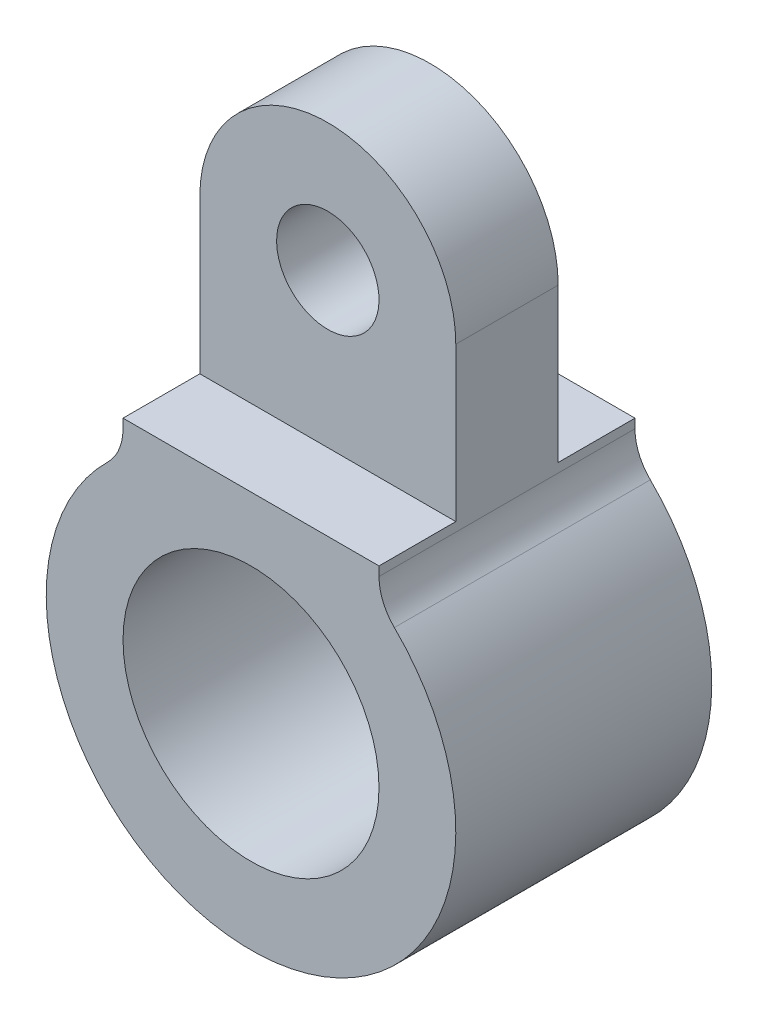
ISO-10303-21;
HEADER;
FILE_DESCRIPTION(('STEP AP214'),'2;1');
FILE_NAME('part.step','',(''),(''),'','','');
FILE_SCHEMA(('AUTOMOTIVE_DESIGN { 1 0 10303 214 1 1 1 1 }'));
ENDSEC;
DATA;
#1=APPLICATION_CONTEXT('core data for automotive mechanical design processes');
#2=APPLICATION_PROTOCOL_DEFINITION('international standard','automotive_design',2000,#1);
#3=PRODUCT_CONTEXT('',#1,'mechanical');
#4=PRODUCT('Part','Part','',(#3));
#5=PRODUCT_RELATED_PRODUCT_CATEGORY('part','',(#4));
#6=PRODUCT_DEFINITION_FORMATION('','',#4);
#7=PRODUCT_DEFINITION_CONTEXT('part definition',#1,'design');
#8=PRODUCT_DEFINITION('design','',#6,#7);
#9=PRODUCT_DEFINITION_SHAPE('','',#8);
#10=(LENGTH_UNIT() NAMED_UNIT(*) SI_UNIT(.MILLI.,.METRE.));
#11=(NAMED_UNIT(*) PLANE_ANGLE_UNIT() SI_UNIT($,.RADIAN.));
#12=(NAMED_UNIT(*) SI_UNIT($,.STERADIAN.) SOLID_ANGLE_UNIT());
#13=UNCERTAINTY_MEASURE_WITH_UNIT(LENGTH_MEASURE(1.E-05),#10,'distance_accuracy_value','');
#14=(GEOMETRIC_REPRESENTATION_CONTEXT(3) GLOBAL_UNCERTAINTY_ASSIGNED_CONTEXT((#13)) GLOBAL_UNIT_ASSIGNED_CONTEXT((#10,
#11,#12)) REPRESENTATION_CONTEXT('',''));
#15=CARTESIAN_POINT('',(0.,0.,0.));
#16=DIRECTION('',(0.,0.,1.));
#17=DIRECTION('',(1.,0.,0.));
#18=AXIS2_PLACEMENT_3D('',#15,#16,#17);
#19=CARTESIAN_POINT('',(0.,27.,20.));
#20=DIRECTION('',(0.,0.,1.));
#21=DIRECTION('',(1.,0.,0.));
#22=AXIS2_PLACEMENT_3D('',#19,#20,#21);
#23=PLANE('',#22);
#24=DIRECTION('',(1.,0.,0.));
#25=VECTOR('',#24,1.);
#26=CARTESIAN_POINT('',(0.,15.,20.));
#27=LINE('',#26,#25);
#28=CARTESIAN_POINT('',(-10.,15.,20.));
#29=VERTEX_POINT('',#28);
#30=CARTESIAN_POINT('',(10.,15.,20.));
#31=VERTEX_POINT('',#30);
#32=EDGE_CURVE('E55',#29,#31,#27,.T.);
#33=ORIENTED_EDGE('',*,*,#32,.F.);
#34=DIRECTION('',(0.,-1.,0.));
#35=VECTOR('',#34,1.);
#36=CARTESIAN_POINT('',(-10.,27.,20.));
#37=LINE('',#36,#35);
#38=CARTESIAN_POINT('',(-10.,14.2828568570857,20.));
#39=VERTEX_POINT('',#38);
#40=EDGE_CURVE('E135',#29,#39,#37,.T.);
#41=ORIENTED_EDGE('',*,*,#40,.T.);
#42=CARTESIAN_POINT('',(-14.,14.2828568570857,20.));
#43=DIRECTION('',(0.,0.,1.));
#44=DIRECTION('',(1.,0.,0.));
#45=AXIS2_PLACEMENT_3D('',#42,#43,#44);
#46=CIRCLE('',#45,4.);
#47=CARTESIAN_POINT('',(-11.2,11.4262854856686,20.));
#48=VERTEX_POINT('',#47);
#49=EDGE_CURVE('E196',#39,#48,#46,.F.);
#50=ORIENTED_EDGE('',*,*,#49,.T.);
#51=CARTESIAN_POINT('',(0.,0.,20.));
#52=DIRECTION('',(0.,0.,1.));
#53=DIRECTION('',(1.,0.,0.));
#54=AXIS2_PLACEMENT_3D('',#51,#52,#53);
#55=CIRCLE('',#54,16.);
#56=CARTESIAN_POINT('',(11.2,11.4262854856686,20.));
#57=VERTEX_POINT('',#56);
#58=EDGE_CURVE('E168',#48,#57,#55,.T.);
#59=ORIENTED_EDGE('',*,*,#58,.T.);
#60=CARTESIAN_POINT('',(14.,14.2828568570857,20.));
#61=DIRECTION('',(0.,0.,1.));
#62=DIRECTION('',(1.,0.,0.));
#63=AXIS2_PLACEMENT_3D('',#60,#61,#62);
#64=CIRCLE('',#63,4.);
#65=CARTESIAN_POINT('',(10.,14.2828568570857,20.));
#66=VERTEX_POINT('',#65);
#67=EDGE_CURVE('E49',#57,#66,#64,.F.);
#68=ORIENTED_EDGE('',*,*,#67,.T.);
#69=DIRECTION('',(0.,-1.,0.));
#70=VECTOR('',#69,1.);
#71=CARTESIAN_POINT('',(10.,27.,20.));
#72=LINE('',#71,#70);
#73=EDGE_CURVE('E172',#31,#66,#72,.T.);
#74=ORIENTED_EDGE('',*,*,#73,.F.);
#75=EDGE_LOOP('',(#33,#41,#50,#59,#68,#74));
#76=FACE_BOUND('',#75,.T.);
#77=CARTESIAN_POINT('',(0.,0.,20.));
#78=DIRECTION('',(0.,0.,1.));
#79=DIRECTION('',(1.,0.,0.));
#80=AXIS2_PLACEMENT_3D('',#77,#78,#79);
#81=CIRCLE('',#80,10.);
#82=CARTESIAN_POINT('',(10.,0.,20.));
#83=VERTEX_POINT('',#82);
#84=EDGE_CURVE('E161',#83,#83,#81,.T.);
#85=ORIENTED_EDGE('',*,*,#84,.F.);
#86=EDGE_LOOP('',(#85));
#87=FACE_BOUND('',#86,.T.);
#88=ADVANCED_FACE('F41',(#76,#87),#23,.T.);
#89=CARTESIAN_POINT('',(0.,27.,0.));
#90=DIRECTION('',(0.,0.,1.));
#91=DIRECTION('',(1.,0.,0.));
#92=AXIS2_PLACEMENT_3D('',#89,#90,#91);
#93=PLANE('',#92);
#94=CARTESIAN_POINT('',(0.,0.,0.));
#95=DIRECTION('',(0.,0.,1.));
#96=DIRECTION('',(1.,0.,0.));
#97=AXIS2_PLACEMENT_3D('',#94,#95,#96);
#98=CIRCLE('',#97,10.);
#99=CARTESIAN_POINT('',(10.,0.,0.));
#100=VERTEX_POINT('',#99);
#101=EDGE_CURVE('E160',#100,#100,#98,.T.);
#102=ORIENTED_EDGE('',*,*,#101,.T.);
#103=EDGE_LOOP('',(#102));
#104=FACE_BOUND('',#103,.T.);
#105=DIRECTION('',(0.,-1.,0.));
#106=VECTOR('',#105,1.);
#107=CARTESIAN_POINT('',(-10.,27.,0.));
#108=LINE('',#107,#106);
#109=CARTESIAN_POINT('',(-10.,15.,0.));
#110=VERTEX_POINT('',#109);
#111=CARTESIAN_POINT('',(-10.,14.2828568570857,0.));
#112=VERTEX_POINT('',#111);
#113=EDGE_CURVE('E164',#110,#112,#108,.T.);
#114=ORIENTED_EDGE('',*,*,#113,.F.);
#115=DIRECTION('',(1.,0.,0.));
#116=VECTOR('',#115,1.);
#117=CARTESIAN_POINT('',(0.,15.,0.));
#118=LINE('',#117,#116);
#119=CARTESIAN_POINT('',(10.,15.,0.));
#120=VERTEX_POINT('',#119);
#121=EDGE_CURVE('E157',#110,#120,#118,.T.);
#122=ORIENTED_EDGE('',*,*,#121,.T.);
#123=DIRECTION('',(0.,-1.,0.));
#124=VECTOR('',#123,1.);
#125=CARTESIAN_POINT('',(10.,27.,0.));
#126=LINE('',#125,#124);
#127=CARTESIAN_POINT('',(10.,14.2828568570857,0.));
#128=VERTEX_POINT('',#127);
#129=EDGE_CURVE('E169',#120,#128,#126,.T.);
#130=ORIENTED_EDGE('',*,*,#129,.T.);
#131=CARTESIAN_POINT('',(14.,14.2828568570857,0.));
#132=DIRECTION('',(0.,0.,1.));
#133=DIRECTION('',(1.,0.,0.));
#134=AXIS2_PLACEMENT_3D('',#131,#132,#133);
#135=CIRCLE('',#134,4.);
#136=CARTESIAN_POINT('',(11.2,11.4262854856686,0.));
#137=VERTEX_POINT('',#136);
#138=EDGE_CURVE('E198',#128,#137,#135,.T.);
#139=ORIENTED_EDGE('',*,*,#138,.T.);
#140=CARTESIAN_POINT('',(0.,0.,0.));
#141=DIRECTION('',(0.,0.,1.));
#142=DIRECTION('',(1.,0.,0.));
#143=AXIS2_PLACEMENT_3D('',#140,#141,#142);
#144=CIRCLE('',#143,16.);
#145=CARTESIAN_POINT('',(-11.2,11.4262854856686,0.));
#146=VERTEX_POINT('',#145);
#147=EDGE_CURVE('E176',#146,#137,#144,.T.);
#148=ORIENTED_EDGE('',*,*,#147,.F.);
#149=CARTESIAN_POINT('',(-14.,14.2828568570857,0.));
#150=DIRECTION('',(0.,0.,1.));
#151=DIRECTION('',(1.,0.,0.));
#152=AXIS2_PLACEMENT_3D('',#149,#150,#151);
#153=CIRCLE('',#152,4.);
#154=EDGE_CURVE('E193',#146,#112,#153,.T.);
#155=ORIENTED_EDGE('',*,*,#154,.T.);
#156=EDGE_LOOP('',(#114,#122,#130,#139,#148,#155));
#157=FACE_BOUND('',#156,.T.);
#158=ADVANCED_FACE('F230',(#104,#157),#93,.F.);
#159=CARTESIAN_POINT('',(0.,27.,20.));
#160=DIRECTION('',(0.,0.,-1.));
#161=DIRECTION('',(-1.,0.,0.));
#162=AXIS2_PLACEMENT_3D('',#159,#160,#161);
#163=CYLINDRICAL_SURFACE('',#162,10.);
#164=DIRECTION('',(0.,0.,-1.));
#165=VECTOR('',#164,1.);
#166=CARTESIAN_POINT('',(-10.,27.,20.));
#167=LINE('',#166,#165);
#168=CARTESIAN_POINT('',(-10.,27.,14.));
#169=VERTEX_POINT('',#168);
#170=CARTESIAN_POINT('',(-10.,27.,6.));
#171=VERTEX_POINT('',#170);
#172=EDGE_CURVE('E181',#169,#171,#167,.T.);
#173=ORIENTED_EDGE('',*,*,#172,.F.);
#174=CARTESIAN_POINT('',(0.,27.,14.));
#175=DIRECTION('',(0.,0.,-1.));
#176=DIRECTION('',(0.,1.,0.));
#177=AXIS2_PLACEMENT_3D('',#174,#175,#176);
#178=CIRCLE('',#177,10.);
#179=CARTESIAN_POINT('',(10.,27.,14.));
#180=VERTEX_POINT('',#179);
#181=EDGE_CURVE('E128',#169,#180,#178,.T.);
#182=ORIENTED_EDGE('',*,*,#181,.T.);
#183=DIRECTION('',(0.,0.,-1.));
#184=VECTOR('',#183,1.);
#185=CARTESIAN_POINT('',(10.,27.,20.));
#186=LINE('',#185,#184);
#187=CARTESIAN_POINT('',(10.,27.,6.));
#188=VERTEX_POINT('',#187);
#189=EDGE_CURVE('E174',#180,#188,#186,.T.);
#190=ORIENTED_EDGE('',*,*,#189,.T.);
#191=CARTESIAN_POINT('',(0.,27.,6.));
#192=DIRECTION('',(0.,0.,1.));
#193=DIRECTION('',(0.,-1.,0.));
#194=AXIS2_PLACEMENT_3D('',#191,#192,#193);
#195=CIRCLE('',#194,10.);
#196=EDGE_CURVE('E154',#188,#171,#195,.T.);
#197=ORIENTED_EDGE('',*,*,#196,.T.);
#198=EDGE_LOOP('',(#173,#182,#190,#197));
#199=FACE_BOUND('',#198,.T.);
#200=ADVANCED_FACE('F236',(#199),#163,.T.);
#201=CARTESIAN_POINT('',(-10.,27.,20.));
#202=DIRECTION('',(1.,0.,0.));
#203=DIRECTION('',(0.,0.,-1.));
#204=AXIS2_PLACEMENT_3D('',#201,#202,#203);
#205=PLANE('',#204);
#206=DIRECTION('',(0.,0.,-1.));
#207=VECTOR('',#206,1.);
#208=CARTESIAN_POINT('',(-10.,15.,14.));
#209=LINE('',#208,#207);
#210=CARTESIAN_POINT('',(-10.,15.,14.));
#211=VERTEX_POINT('',#210);
#212=EDGE_CURVE('E119',#29,#211,#209,.T.);
#213=ORIENTED_EDGE('',*,*,#212,.T.);
#214=DIRECTION('',(0.,1.,0.));
#215=VECTOR('',#214,1.);
#216=CARTESIAN_POINT('',(-10.,37.9999999999998,14.));
#217=LINE('',#216,#215);
#218=EDGE_CURVE('E123',#211,#169,#217,.T.);
#219=ORIENTED_EDGE('',*,*,#218,.T.);
#220=ORIENTED_EDGE('',*,*,#172,.T.);
#221=DIRECTION('',(0.,-1.,0.));
#222=VECTOR('',#221,1.);
#223=CARTESIAN_POINT('',(-10.,37.9999999999998,6.));
#224=LINE('',#223,#222);
#225=CARTESIAN_POINT('',(-10.,15.,6.));
#226=VERTEX_POINT('',#225);
#227=EDGE_CURVE('E143',#171,#226,#224,.T.);
#228=ORIENTED_EDGE('',*,*,#227,.T.);
#229=DIRECTION('',(0.,0.,-1.));
#230=VECTOR('',#229,1.);
#231=CARTESIAN_POINT('',(-10.,15.,6.));
#232=LINE('',#231,#230);
#233=EDGE_CURVE('E146',#226,#110,#232,.T.);
#234=ORIENTED_EDGE('',*,*,#233,.T.);
#235=ORIENTED_EDGE('',*,*,#113,.T.);
#236=DIRECTION('',(0.,0.,1.));
#237=VECTOR('',#236,1.);
#238=CARTESIAN_POINT('',(-10.,14.2828568570857,20.));
#239=LINE('',#238,#237);
#240=EDGE_CURVE('E188',#112,#39,#239,.T.);
#241=ORIENTED_EDGE('',*,*,#240,.T.);
#242=ORIENTED_EDGE('',*,*,#40,.F.);
#243=EDGE_LOOP('',(#213,#219,#220,#228,#234,#235,#241,#242));
#244=FACE_BOUND('',#243,.T.);
#245=ADVANCED_FACE('F133',(#244),#205,.F.);
#246=CARTESIAN_POINT('',(0.,0.,20.));
#247=DIRECTION('',(0.,0.,-1.));
#248=DIRECTION('',(-1.,0.,0.));
#249=AXIS2_PLACEMENT_3D('',#246,#247,#248);
#250=CYLINDRICAL_SURFACE('',#249,16.);
#251=ORIENTED_EDGE('',*,*,#58,.F.);
#252=DIRECTION('',(0.,0.,-1.));
#253=VECTOR('',#252,1.);
#254=CARTESIAN_POINT('',(-11.2,11.4262854856686,20.));
#255=LINE('',#254,#253);
#256=EDGE_CURVE('E185',#48,#146,#255,.T.);
#257=ORIENTED_EDGE('',*,*,#256,.T.);
#258=ORIENTED_EDGE('',*,*,#147,.T.);
#259=DIRECTION('',(0.,0.,-1.));
#260=VECTOR('',#259,1.);
#261=CARTESIAN_POINT('',(11.2,11.4262854856686,20.));
#262=LINE('',#261,#260);
#263=EDGE_CURVE('E183',#137,#57,#262,.F.);
#264=ORIENTED_EDGE('',*,*,#263,.T.);
#265=EDGE_LOOP('',(#251,#257,#258,#264));
#266=FACE_BOUND('',#265,.T.);
#267=ADVANCED_FACE('F246',(#266),#250,.T.);
#268=CARTESIAN_POINT('',(10.,27.,20.));
#269=DIRECTION('',(1.,0.,0.));
#270=DIRECTION('',(0.,0.,-1.));
#271=AXIS2_PLACEMENT_3D('',#268,#269,#270);
#272=PLANE('',#271);
#273=DIRECTION('',(0.,1.,0.));
#274=VECTOR('',#273,1.);
#275=CARTESIAN_POINT('',(10.,37.9999999999998,14.));
#276=LINE('',#275,#274);
#277=CARTESIAN_POINT('',(10.,15.,14.));
#278=VERTEX_POINT('',#277);
#279=EDGE_CURVE('E136',#278,#180,#276,.T.);
#280=ORIENTED_EDGE('',*,*,#279,.F.);
#281=DIRECTION('',(0.,0.,-1.));
#282=VECTOR('',#281,1.);
#283=CARTESIAN_POINT('',(10.,15.,20.));
#284=LINE('',#283,#282);
#285=EDGE_CURVE('E11',#31,#278,#284,.T.);
#286=ORIENTED_EDGE('',*,*,#285,.F.);
#287=ORIENTED_EDGE('',*,*,#73,.T.);
#288=DIRECTION('',(0.,0.,-1.));
#289=VECTOR('',#288,1.);
#290=CARTESIAN_POINT('',(10.,14.2828568570857,20.));
#291=LINE('',#290,#289);
#292=EDGE_CURVE('E190',#66,#128,#291,.T.);
#293=ORIENTED_EDGE('',*,*,#292,.T.);
#294=ORIENTED_EDGE('',*,*,#129,.F.);
#295=DIRECTION('',(0.,0.,-1.));
#296=VECTOR('',#295,1.);
#297=CARTESIAN_POINT('',(10.,15.,6.));
#298=LINE('',#297,#296);
#299=CARTESIAN_POINT('',(10.,15.,6.));
#300=VERTEX_POINT('',#299);
#301=EDGE_CURVE('E147',#300,#120,#298,.T.);
#302=ORIENTED_EDGE('',*,*,#301,.F.);
#303=DIRECTION('',(0.,-1.,0.));
#304=VECTOR('',#303,1.);
#305=CARTESIAN_POINT('',(10.,37.9999999999998,6.));
#306=LINE('',#305,#304);
#307=EDGE_CURVE('E142',#188,#300,#306,.T.);
#308=ORIENTED_EDGE('',*,*,#307,.F.);
#309=ORIENTED_EDGE('',*,*,#189,.F.);
#310=EDGE_LOOP('',(#280,#286,#287,#293,#294,#302,#308,#309));
#311=FACE_BOUND('',#310,.T.);
#312=ADVANCED_FACE('F227',(#311),#272,.T.);
#313=CARTESIAN_POINT('',(0.,0.,20.));
#314=DIRECTION('',(0.,0.,-1.));
#315=DIRECTION('',(-1.,0.,0.));
#316=AXIS2_PLACEMENT_3D('',#313,#314,#315);
#317=CYLINDRICAL_SURFACE('',#316,10.);
#318=ORIENTED_EDGE('',*,*,#84,.T.);
#319=EDGE_LOOP('',(#318));
#320=FACE_BOUND('',#319,.T.);
#321=ORIENTED_EDGE('',*,*,#101,.F.);
#322=EDGE_LOOP('',(#321));
#323=FACE_BOUND('',#322,.T.);
#324=ADVANCED_FACE('F211',(#320,#323),#317,.F.);
#325=CARTESIAN_POINT('',(0.,27.,20.));
#326=DIRECTION('',(0.,0.,-1.));
#327=DIRECTION('',(-1.,0.,0.));
#328=AXIS2_PLACEMENT_3D('',#325,#326,#327);
#329=CYLINDRICAL_SURFACE('',#328,4.);
#330=CARTESIAN_POINT('',(0.,27.,14.));
#331=DIRECTION('',(0.,0.,-1.));
#332=DIRECTION('',(0.,1.,0.));
#333=AXIS2_PLACEMENT_3D('',#330,#331,#332);
#334=CIRCLE('',#333,4.);
#335=CARTESIAN_POINT('',(0.,31.,14.));
#336=VERTEX_POINT('',#335);
#337=EDGE_CURVE('E122',#336,#336,#334,.T.);
#338=ORIENTED_EDGE('',*,*,#337,.F.);
#339=EDGE_LOOP('',(#338));
#340=FACE_BOUND('',#339,.T.);
#341=CARTESIAN_POINT('',(0.,27.,6.));
#342=DIRECTION('',(0.,0.,1.));
#343=DIRECTION('',(0.,-1.,0.));
#344=AXIS2_PLACEMENT_3D('',#341,#342,#343);
#345=CIRCLE('',#344,4.);
#346=CARTESIAN_POINT('',(0.,23.,6.));
#347=VERTEX_POINT('',#346);
#348=EDGE_CURVE('E153',#347,#347,#345,.T.);
#349=ORIENTED_EDGE('',*,*,#348,.F.);
#350=EDGE_LOOP('',(#349));
#351=FACE_BOUND('',#350,.T.);
#352=ADVANCED_FACE('F207',(#340,#351),#329,.F.);
#353=CARTESIAN_POINT('',(-14.,14.2828568570857,20.));
#354=DIRECTION('',(0.,0.,-1.));
#355=DIRECTION('',(-1.,0.,0.));
#356=AXIS2_PLACEMENT_3D('',#353,#354,#355);
#357=CYLINDRICAL_SURFACE('',#356,4.);
#358=ORIENTED_EDGE('',*,*,#49,.F.);
#359=ORIENTED_EDGE('',*,*,#240,.F.);
#360=ORIENTED_EDGE('',*,*,#154,.F.);
#361=ORIENTED_EDGE('',*,*,#256,.F.);
#362=EDGE_LOOP('',(#358,#359,#360,#361));
#363=FACE_BOUND('',#362,.T.);
#364=ADVANCED_FACE('F210',(#363),#357,.F.);
#365=CARTESIAN_POINT('',(14.,14.2828568570857,20.));
#366=DIRECTION('',(0.,0.,-1.));
#367=DIRECTION('',(-1.,0.,0.));
#368=AXIS2_PLACEMENT_3D('',#365,#366,#367);
#369=CYLINDRICAL_SURFACE('',#368,4.);
#370=ORIENTED_EDGE('',*,*,#67,.F.);
#371=ORIENTED_EDGE('',*,*,#263,.F.);
#372=ORIENTED_EDGE('',*,*,#138,.F.);
#373=ORIENTED_EDGE('',*,*,#292,.F.);
#374=EDGE_LOOP('',(#370,#371,#372,#373));
#375=FACE_BOUND('',#374,.T.);
#376=ADVANCED_FACE('F43',(#375),#369,.F.);
#377=CARTESIAN_POINT('',(-10.,15.,6.));
#378=DIRECTION('',(0.,-1.,0.));
#379=DIRECTION('',(0.,0.,-1.));
#380=AXIS2_PLACEMENT_3D('',#377,#378,#379);
#381=PLANE('',#380);
#382=ORIENTED_EDGE('',*,*,#233,.F.);
#383=DIRECTION('',(1.,0.,0.));
#384=VECTOR('',#383,1.);
#385=CARTESIAN_POINT('',(-10.,15.,6.));
#386=LINE('',#385,#384);
#387=EDGE_CURVE('E63',#226,#300,#386,.T.);
#388=ORIENTED_EDGE('',*,*,#387,.T.);
#389=ORIENTED_EDGE('',*,*,#301,.T.);
#390=ORIENTED_EDGE('',*,*,#121,.F.);
#391=EDGE_LOOP('',(#382,#388,#389,#390));
#392=FACE_BOUND('',#391,.T.);
#393=ADVANCED_FACE('F218',(#392),#381,.F.);
#394=CARTESIAN_POINT('',(-10.,37.9999999999998,6.));
#395=DIRECTION('',(0.,0.,1.));
#396=DIRECTION('',(0.,-1.,0.));
#397=AXIS2_PLACEMENT_3D('',#394,#395,#396);
#398=PLANE('',#397);
#399=ORIENTED_EDGE('',*,*,#348,.T.);
#400=EDGE_LOOP('',(#399));
#401=FACE_BOUND('',#400,.T.);
#402=ORIENTED_EDGE('',*,*,#307,.T.);
#403=ORIENTED_EDGE('',*,*,#387,.F.);
#404=ORIENTED_EDGE('',*,*,#227,.F.);
#405=ORIENTED_EDGE('',*,*,#196,.F.);
#406=EDGE_LOOP('',(#402,#403,#404,#405));
#407=FACE_BOUND('',#406,.T.);
#408=ADVANCED_FACE('F215',(#401,#407),#398,.F.);
#409=CARTESIAN_POINT('',(-10.,37.9999999999998,14.));
#410=DIRECTION('',(0.,0.,-1.));
#411=DIRECTION('',(0.,1.,0.));
#412=AXIS2_PLACEMENT_3D('',#409,#410,#411);
#413=PLANE('',#412);
#414=ORIENTED_EDGE('',*,*,#337,.T.);
#415=EDGE_LOOP('',(#414));
#416=FACE_BOUND('',#415,.T.);
#417=ORIENTED_EDGE('',*,*,#218,.F.);
#418=DIRECTION('',(1.,0.,0.));
#419=VECTOR('',#418,1.);
#420=CARTESIAN_POINT('',(-10.,15.,14.));
#421=LINE('',#420,#419);
#422=EDGE_CURVE('E115',#211,#278,#421,.T.);
#423=ORIENTED_EDGE('',*,*,#422,.T.);
#424=ORIENTED_EDGE('',*,*,#279,.T.);
#425=ORIENTED_EDGE('',*,*,#181,.F.);
#426=EDGE_LOOP('',(#417,#423,#424,#425));
#427=FACE_BOUND('',#426,.T.);
#428=ADVANCED_FACE('F126',(#416,#427),#413,.F.);
#429=CARTESIAN_POINT('',(-10.,15.,14.));
#430=DIRECTION('',(0.,-1.,0.));
#431=DIRECTION('',(0.,0.,-1.));
#432=AXIS2_PLACEMENT_3D('',#429,#430,#431);
#433=PLANE('',#432);
#434=ORIENTED_EDGE('',*,*,#32,.T.);
#435=ORIENTED_EDGE('',*,*,#285,.T.);
#436=ORIENTED_EDGE('',*,*,#422,.F.);
#437=ORIENTED_EDGE('',*,*,#212,.F.);
#438=EDGE_LOOP('',(#434,#435,#436,#437));
#439=FACE_BOUND('',#438,.T.);
#440=ADVANCED_FACE('F117',(#439),#433,.F.);
#441=CLOSED_SHELL('',(#88,#158,#200,#245,#267,#312,#324,#352,#364,#376,#393,#408,#428,#440));
#442=MANIFOLD_SOLID_BREP('B2',#441);
#443=ADVANCED_BREP_SHAPE_REPRESENTATION('',(#18,#442),#14);
#444=SHAPE_DEFINITION_REPRESENTATION(#9,#443);
ENDSEC;
END-ISO-10303-21;
